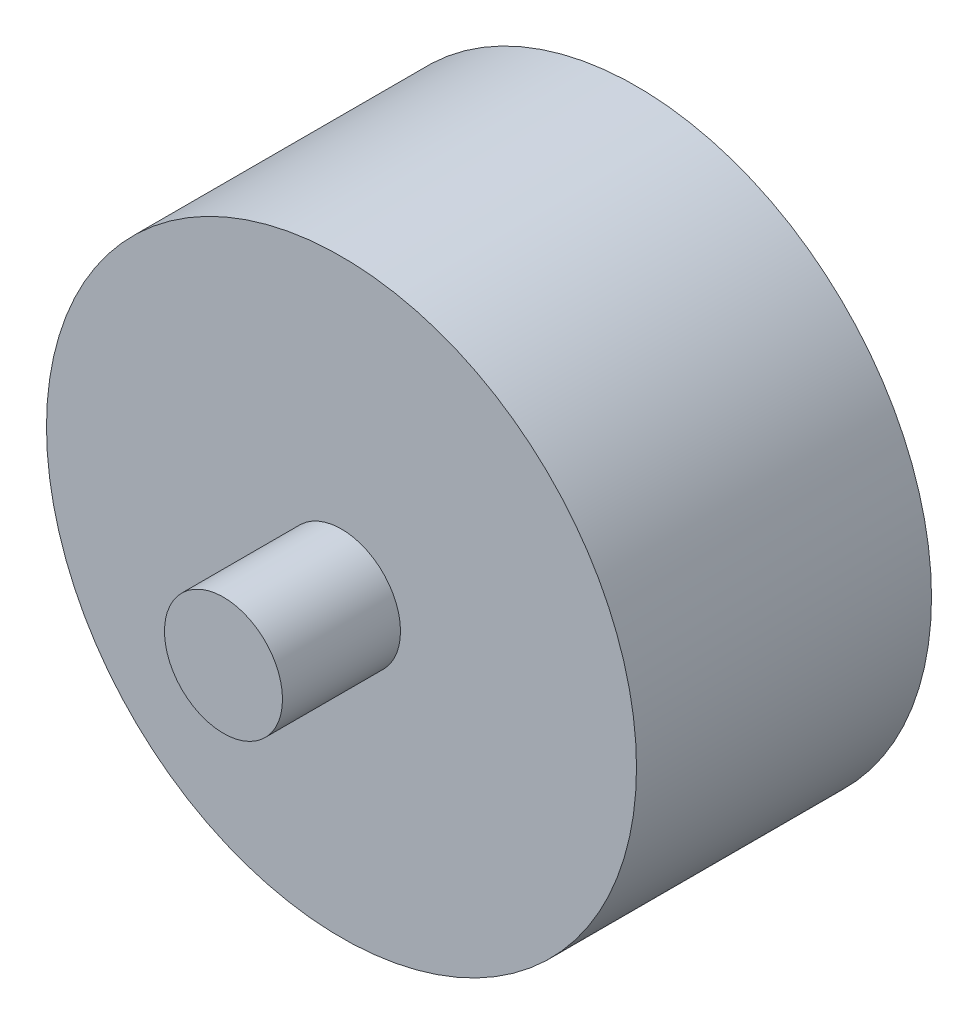
ISO-10303-21;
HEADER;
FILE_DESCRIPTION(('STEP AP214'),'2;1');
FILE_NAME('part.step','',(''),(''),'','','');
FILE_SCHEMA(('AUTOMOTIVE_DESIGN { 1 0 10303 214 1 1 1 1 }'));
ENDSEC;
DATA;
#1=APPLICATION_CONTEXT('core data for automotive mechanical design processes');
#2=APPLICATION_PROTOCOL_DEFINITION('international standard','automotive_design',2000,#1);
#3=PRODUCT_CONTEXT('',#1,'mechanical');
#4=PRODUCT('Part','Part','',(#3));
#5=PRODUCT_RELATED_PRODUCT_CATEGORY('part','',(#4));
#6=PRODUCT_DEFINITION_FORMATION('','',#4);
#7=PRODUCT_DEFINITION_CONTEXT('part definition',#1,'design');
#8=PRODUCT_DEFINITION('design','',#6,#7);
#9=PRODUCT_DEFINITION_SHAPE('','',#8);
#10=(LENGTH_UNIT() NAMED_UNIT(*) SI_UNIT(.MILLI.,.METRE.));
#11=(NAMED_UNIT(*) PLANE_ANGLE_UNIT() SI_UNIT($,.RADIAN.));
#12=(NAMED_UNIT(*) SI_UNIT($,.STERADIAN.) SOLID_ANGLE_UNIT());
#13=UNCERTAINTY_MEASURE_WITH_UNIT(LENGTH_MEASURE(1.E-05),#10,'distance_accuracy_value','');
#14=(GEOMETRIC_REPRESENTATION_CONTEXT(3) GLOBAL_UNCERTAINTY_ASSIGNED_CONTEXT((#13)) GLOBAL_UNIT_ASSIGNED_CONTEXT((#10,
#11,#12)) REPRESENTATION_CONTEXT('',''));
#15=CARTESIAN_POINT('',(0.,0.,0.));
#16=DIRECTION('',(0.,0.,1.));
#17=DIRECTION('',(1.,0.,0.));
#18=AXIS2_PLACEMENT_3D('',#15,#16,#17);
#19=CARTESIAN_POINT('',(0.,0.,25.));
#20=DIRECTION('',(0.,0.,-1.));
#21=DIRECTION('',(-1.,0.,0.));
#22=AXIS2_PLACEMENT_3D('',#19,#20,#21);
#23=CYLINDRICAL_SURFACE('',#22,50.);
#24=CARTESIAN_POINT('',(0.,0.,25.));
#25=DIRECTION('',(0.,0.,1.));
#26=DIRECTION('',(1.,0.,0.));
#27=AXIS2_PLACEMENT_3D('',#24,#25,#26);
#28=CIRCLE('',#27,50.);
#29=CARTESIAN_POINT('',(50.,0.,25.));
#30=VERTEX_POINT('',#29);
#31=EDGE_CURVE('E51',#30,#30,#28,.T.);
#32=ORIENTED_EDGE('',*,*,#31,.F.);
#33=EDGE_LOOP('',(#32));
#34=FACE_BOUND('',#33,.T.);
#35=CARTESIAN_POINT('',(0.,0.,-25.));
#36=DIRECTION('',(0.,0.,1.));
#37=DIRECTION('',(1.,0.,0.));
#38=AXIS2_PLACEMENT_3D('',#35,#36,#37);
#39=CIRCLE('',#38,50.);
#40=CARTESIAN_POINT('',(50.,0.,-25.));
#41=VERTEX_POINT('',#40);
#42=EDGE_CURVE('E40',#41,#41,#39,.T.);
#43=ORIENTED_EDGE('',*,*,#42,.T.);
#44=EDGE_LOOP('',(#43));
#45=FACE_BOUND('',#44,.T.);
#46=ADVANCED_FACE('F37',(#34,#45),#23,.T.);
#47=CARTESIAN_POINT('',(0.,0.,25.));
#48=DIRECTION('',(0.,0.,1.));
#49=DIRECTION('',(1.,0.,0.));
#50=AXIS2_PLACEMENT_3D('',#47,#48,#49);
#51=PLANE('',#50);
#52=CARTESIAN_POINT('',(0.,0.,25.));
#53=DIRECTION('',(0.,0.,1.));
#54=DIRECTION('',(1.,0.,0.));
#55=AXIS2_PLACEMENT_3D('',#52,#53,#54);
#56=CIRCLE('',#55,10.);
#57=CARTESIAN_POINT('',(10.,0.,25.));
#58=VERTEX_POINT('',#57);
#59=EDGE_CURVE('E10',#58,#58,#56,.T.);
#60=ORIENTED_EDGE('',*,*,#59,.F.);
#61=EDGE_LOOP('',(#60));
#62=FACE_BOUND('',#61,.T.);
#63=ORIENTED_EDGE('',*,*,#31,.T.);
#64=EDGE_LOOP('',(#63));
#65=FACE_BOUND('',#64,.T.);
#66=ADVANCED_FACE('F71',(#62,#65),#51,.T.);
#67=CARTESIAN_POINT('',(0.,0.,-25.));
#68=DIRECTION('',(0.,0.,1.));
#69=DIRECTION('',(1.,0.,0.));
#70=AXIS2_PLACEMENT_3D('',#67,#68,#69);
#71=PLANE('',#70);
#72=CARTESIAN_POINT('',(0.,0.,-25.));
#73=DIRECTION('',(0.,0.,-1.));
#74=DIRECTION('',(-1.,0.,0.));
#75=AXIS2_PLACEMENT_3D('',#72,#73,#74);
#76=CIRCLE('',#75,10.);
#77=CARTESIAN_POINT('',(-10.,0.,-25.));
#78=VERTEX_POINT('',#77);
#79=EDGE_CURVE('E45',#78,#78,#76,.T.);
#80=ORIENTED_EDGE('',*,*,#79,.F.);
#81=EDGE_LOOP('',(#80));
#82=FACE_BOUND('',#81,.T.);
#83=ORIENTED_EDGE('',*,*,#42,.F.);
#84=EDGE_LOOP('',(#83));
#85=FACE_BOUND('',#84,.T.);
#86=ADVANCED_FACE('F68',(#82,#85),#71,.F.);
#87=CARTESIAN_POINT('',(0.,0.,-45.));
#88=DIRECTION('',(0.,0.,1.));
#89=DIRECTION('',(1.,0.,0.));
#90=AXIS2_PLACEMENT_3D('',#87,#88,#89);
#91=CYLINDRICAL_SURFACE('',#90,10.);
#92=CARTESIAN_POINT('',(0.,0.,-45.));
#93=DIRECTION('',(0.,0.,-1.));
#94=DIRECTION('',(-1.,0.,0.));
#95=AXIS2_PLACEMENT_3D('',#92,#93,#94);
#96=CIRCLE('',#95,10.);
#97=CARTESIAN_POINT('',(-10.,0.,-45.));
#98=VERTEX_POINT('',#97);
#99=EDGE_CURVE('E56',#98,#98,#96,.T.);
#100=ORIENTED_EDGE('',*,*,#99,.F.);
#101=EDGE_LOOP('',(#100));
#102=FACE_BOUND('',#101,.T.);
#103=ORIENTED_EDGE('',*,*,#79,.T.);
#104=EDGE_LOOP('',(#103));
#105=FACE_BOUND('',#104,.T.);
#106=ADVANCED_FACE('F70',(#102,#105),#91,.T.);
#107=CARTESIAN_POINT('',(0.,0.,-45.));
#108=DIRECTION('',(0.,0.,-1.));
#109=DIRECTION('',(-1.,0.,0.));
#110=AXIS2_PLACEMENT_3D('',#107,#108,#109);
#111=PLANE('',#110);
#112=ORIENTED_EDGE('',*,*,#99,.T.);
#113=EDGE_LOOP('',(#112));
#114=FACE_BOUND('',#113,.T.);
#115=ADVANCED_FACE('F77',(#114),#111,.T.);
#116=CARTESIAN_POINT('',(0.,0.,45.));
#117=DIRECTION('',(0.,0.,-1.));
#118=DIRECTION('',(-1.,0.,0.));
#119=AXIS2_PLACEMENT_3D('',#116,#117,#118);
#120=CYLINDRICAL_SURFACE('',#119,10.);
#121=CARTESIAN_POINT('',(0.,0.,45.));
#122=DIRECTION('',(0.,0.,1.));
#123=DIRECTION('',(1.,0.,0.));
#124=AXIS2_PLACEMENT_3D('',#121,#122,#123);
#125=CIRCLE('',#124,10.);
#126=CARTESIAN_POINT('',(10.,0.,45.));
#127=VERTEX_POINT('',#126);
#128=EDGE_CURVE('E55',#127,#127,#125,.T.);
#129=ORIENTED_EDGE('',*,*,#128,.F.);
#130=EDGE_LOOP('',(#129));
#131=FACE_BOUND('',#130,.T.);
#132=ORIENTED_EDGE('',*,*,#59,.T.);
#133=EDGE_LOOP('',(#132));
#134=FACE_BOUND('',#133,.T.);
#135=ADVANCED_FACE('F102',(#131,#134),#120,.T.);
#136=CARTESIAN_POINT('',(0.,0.,45.));
#137=DIRECTION('',(0.,0.,1.));
#138=DIRECTION('',(1.,0.,0.));
#139=AXIS2_PLACEMENT_3D('',#136,#137,#138);
#140=PLANE('',#139);
#141=ORIENTED_EDGE('',*,*,#128,.T.);
#142=EDGE_LOOP('',(#141));
#143=FACE_BOUND('',#142,.T.);
#144=ADVANCED_FACE('F107',(#143),#140,.T.);
#145=CLOSED_SHELL('',(#46,#66,#86,#106,#115,#135,#144));
#146=MANIFOLD_SOLID_BREP('B2',#145);
#147=ADVANCED_BREP_SHAPE_REPRESENTATION('',(#18,#146),#14);
#148=SHAPE_DEFINITION_REPRESENTATION(#9,#147);
ENDSEC;
END-ISO-10303-21;
